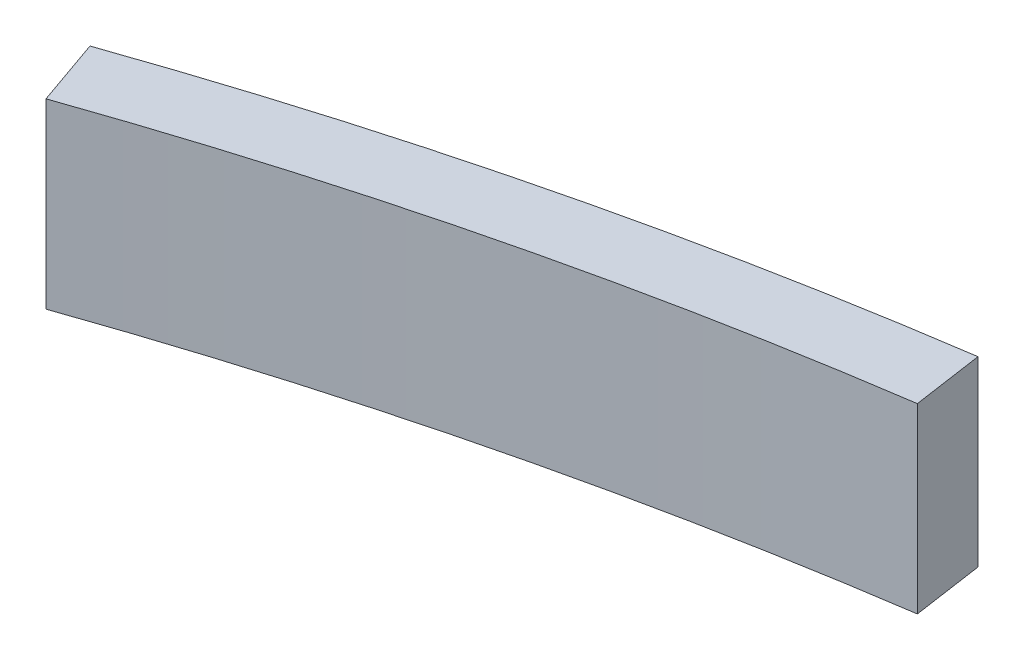
ISO-10303-21;
HEADER;
FILE_DESCRIPTION(('STEP AP214'),'2;1');
FILE_NAME('part.step','',(''),(''),'','','');
FILE_SCHEMA(('AUTOMOTIVE_DESIGN { 1 0 10303 214 1 1 1 1 }'));
ENDSEC;
DATA;
#1=APPLICATION_CONTEXT('core data for automotive mechanical design processes');
#2=APPLICATION_PROTOCOL_DEFINITION('international standard','automotive_design',2000,#1);
#3=PRODUCT_CONTEXT('',#1,'mechanical');
#4=PRODUCT('Part','Part','',(#3));
#5=PRODUCT_RELATED_PRODUCT_CATEGORY('part','',(#4));
#6=PRODUCT_DEFINITION_FORMATION('','',#4);
#7=PRODUCT_DEFINITION_CONTEXT('part definition',#1,'design');
#8=PRODUCT_DEFINITION('design','',#6,#7);
#9=PRODUCT_DEFINITION_SHAPE('','',#8);
#10=(LENGTH_UNIT() NAMED_UNIT(*) SI_UNIT(.MILLI.,.METRE.));
#11=(NAMED_UNIT(*) PLANE_ANGLE_UNIT() SI_UNIT($,.RADIAN.));
#12=(NAMED_UNIT(*) SI_UNIT($,.STERADIAN.) SOLID_ANGLE_UNIT());
#13=UNCERTAINTY_MEASURE_WITH_UNIT(LENGTH_MEASURE(1.E-05),#10,'distance_accuracy_value','');
#14=(GEOMETRIC_REPRESENTATION_CONTEXT(3) GLOBAL_UNCERTAINTY_ASSIGNED_CONTEXT((#13)) GLOBAL_UNIT_ASSIGNED_CONTEXT((#10,
#11,#12)) REPRESENTATION_CONTEXT('',''));
#15=CARTESIAN_POINT('',(0.,0.,0.));
#16=DIRECTION('',(0.,0.,1.));
#17=DIRECTION('',(1.,0.,0.));
#18=AXIS2_PLACEMENT_3D('',#15,#16,#17);
#19=CARTESIAN_POINT('',(0.,25.4,0.));
#20=DIRECTION('',(0.,-1.,0.));
#21=DIRECTION('',(0.,0.,-1.));
#22=AXIS2_PLACEMENT_3D('',#19,#20,#21);
#23=CYLINDRICAL_SURFACE('',#22,524.);
#24=CARTESIAN_POINT('',(0.,0.,0.));
#25=DIRECTION('',(0.,-1.,0.));
#26=DIRECTION('',(0.,0.,-1.));
#27=AXIS2_PLACEMENT_3D('',#24,#25,#26);
#28=CIRCLE('',#27,524.);
#29=CARTESIAN_POINT('',(-173.09106338937,0.,-494.586174265655));
#30=VERTEX_POINT('',#29);
#31=CARTESIAN_POINT('',(-75.5394019961131,0.,-518.526565130534));
#32=VERTEX_POINT('',#31);
#33=EDGE_CURVE('E106',#30,#32,#28,.T.);
#34=ORIENTED_EDGE('',*,*,#33,.T.);
#35=DIRECTION('',(0.,-1.,0.));
#36=VECTOR('',#35,1.);
#37=CARTESIAN_POINT('',(-75.5394019961131,25.4,-518.526565130534));
#38=LINE('',#37,#36);
#39=CARTESIAN_POINT('',(-75.5394019961131,25.4,-518.526565130534));
#40=VERTEX_POINT('',#39);
#41=EDGE_CURVE('E11',#40,#32,#38,.T.);
#42=ORIENTED_EDGE('',*,*,#41,.F.);
#43=CARTESIAN_POINT('',(0.,25.4,0.));
#44=DIRECTION('',(0.,-1.,0.));
#45=DIRECTION('',(0.,0.,-1.));
#46=AXIS2_PLACEMENT_3D('',#43,#44,#45);
#47=CIRCLE('',#46,524.);
#48=CARTESIAN_POINT('',(-173.09106338937,25.4,-494.586174265655));
#49=VERTEX_POINT('',#48);
#50=EDGE_CURVE('E94',#49,#40,#47,.T.);
#51=ORIENTED_EDGE('',*,*,#50,.F.);
#52=DIRECTION('',(0.,-1.,0.));
#53=VECTOR('',#52,1.);
#54=CARTESIAN_POINT('',(-173.09106338937,25.4,-494.586174265655));
#55=LINE('',#54,#53);
#56=EDGE_CURVE('E102',#49,#30,#55,.T.);
#57=ORIENTED_EDGE('',*,*,#56,.T.);
#58=EDGE_LOOP('',(#34,#42,#51,#57));
#59=FACE_BOUND('',#58,.T.);
#60=ADVANCED_FACE('F43',(#59),#23,.F.);
#61=CARTESIAN_POINT('',(-75.5394019961131,25.4,-518.526565130534));
#62=DIRECTION('',(-0.989554513607889,0.,0.14415916411472));
#63=DIRECTION('',(0.14415916411472,0.,0.989554513607889));
#64=AXIS2_PLACEMENT_3D('',#61,#62,#63);
#65=PLANE('',#64);
#66=DIRECTION('',(-0.14415916411472,0.,-0.989554513607889));
#67=VECTOR('',#66,1.);
#68=CARTESIAN_POINT('',(-75.5394019961131,0.,-518.526565130534));
#69=LINE('',#68,#67);
#70=CARTESIAN_POINT('',(-76.9809936372605,0.,-528.422110266613));
#71=VERTEX_POINT('',#70);
#72=EDGE_CURVE('E98',#32,#71,#69,.T.);
#73=ORIENTED_EDGE('',*,*,#72,.T.);
#74=DIRECTION('',(0.,-1.,0.));
#75=VECTOR('',#74,1.);
#76=CARTESIAN_POINT('',(-76.9809936372605,25.4,-528.422110266613));
#77=LINE('',#76,#75);
#78=CARTESIAN_POINT('',(-76.9809936372605,25.4,-528.422110266613));
#79=VERTEX_POINT('',#78);
#80=EDGE_CURVE('E51',#79,#71,#77,.T.);
#81=ORIENTED_EDGE('',*,*,#80,.F.);
#82=DIRECTION('',(-0.14415916411472,0.,-0.989554513607889));
#83=VECTOR('',#82,1.);
#84=CARTESIAN_POINT('',(-75.5394019961131,25.4,-518.526565130534));
#85=LINE('',#84,#83);
#86=EDGE_CURVE('E89',#40,#79,#85,.T.);
#87=ORIENTED_EDGE('',*,*,#86,.F.);
#88=ORIENTED_EDGE('',*,*,#41,.T.);
#89=EDGE_LOOP('',(#73,#81,#87,#88));
#90=FACE_BOUND('',#89,.T.);
#91=ADVANCED_FACE('F97',(#90),#65,.F.);
#92=CARTESIAN_POINT('',(0.,25.4,0.));
#93=DIRECTION('',(0.,-1.,0.));
#94=DIRECTION('',(0.,0.,-1.));
#95=AXIS2_PLACEMENT_3D('',#92,#93,#94);
#96=CYLINDRICAL_SURFACE('',#95,534.);
#97=CARTESIAN_POINT('',(0.,0.,0.));
#98=DIRECTION('',(0.,1.,0.));
#99=DIRECTION('',(0.,0.,-1.));
#100=AXIS2_PLACEMENT_3D('',#97,#98,#99);
#101=CIRCLE('',#100,534.);
#102=CARTESIAN_POINT('',(-176.394327957869,0.,-504.024841713473));
#103=VERTEX_POINT('',#102);
#104=EDGE_CURVE('E76',#71,#103,#101,.T.);
#105=ORIENTED_EDGE('',*,*,#104,.T.);
#106=DIRECTION('',(0.,-1.,0.));
#107=VECTOR('',#106,1.);
#108=CARTESIAN_POINT('',(-176.394327957869,25.4,-504.024841713473));
#109=LINE('',#108,#107);
#110=CARTESIAN_POINT('',(-176.394327957869,25.4,-504.024841713473));
#111=VERTEX_POINT('',#110);
#112=EDGE_CURVE('E99',#111,#103,#109,.T.);
#113=ORIENTED_EDGE('',*,*,#112,.F.);
#114=CARTESIAN_POINT('',(0.,25.4,0.));
#115=DIRECTION('',(0.,1.,0.));
#116=DIRECTION('',(0.,0.,-1.));
#117=AXIS2_PLACEMENT_3D('',#114,#115,#116);
#118=CIRCLE('',#117,534.);
#119=EDGE_CURVE('E92',#79,#111,#118,.T.);
#120=ORIENTED_EDGE('',*,*,#119,.F.);
#121=ORIENTED_EDGE('',*,*,#80,.T.);
#122=EDGE_LOOP('',(#105,#113,#120,#121));
#123=FACE_BOUND('',#122,.T.);
#124=ADVANCED_FACE('F100',(#123),#96,.T.);
#125=CARTESIAN_POINT('',(-173.09106338937,25.4,-494.586174265655));
#126=DIRECTION('',(0.943866744781785,0.,-0.330326456849943));
#127=DIRECTION('',(-0.330326456849943,0.,-0.943866744781785));
#128=AXIS2_PLACEMENT_3D('',#125,#126,#127);
#129=PLANE('',#128);
#130=DIRECTION('',(0.330326456849943,0.,0.943866744781785));
#131=VECTOR('',#130,1.);
#132=CARTESIAN_POINT('',(-173.09106338937,0.,-494.586174265655));
#133=LINE('',#132,#131);
#134=EDGE_CURVE('E82',#103,#30,#133,.T.);
#135=ORIENTED_EDGE('',*,*,#134,.T.);
#136=ORIENTED_EDGE('',*,*,#56,.F.);
#137=DIRECTION('',(0.330326456849943,0.,0.943866744781785));
#138=VECTOR('',#137,1.);
#139=CARTESIAN_POINT('',(-173.09106338937,25.4,-494.586174265655));
#140=LINE('',#139,#138);
#141=EDGE_CURVE('E59',#111,#49,#140,.T.);
#142=ORIENTED_EDGE('',*,*,#141,.F.);
#143=ORIENTED_EDGE('',*,*,#112,.T.);
#144=EDGE_LOOP('',(#135,#136,#142,#143));
#145=FACE_BOUND('',#144,.T.);
#146=ADVANCED_FACE('F113',(#145),#129,.F.);
#147=CARTESIAN_POINT('',(0.,25.4,0.));
#148=DIRECTION('',(0.,-1.,0.));
#149=DIRECTION('',(0.,0.,-1.));
#150=AXIS2_PLACEMENT_3D('',#147,#148,#149);
#151=PLANE('',#150);
#152=ORIENTED_EDGE('',*,*,#50,.T.);
#153=ORIENTED_EDGE('',*,*,#86,.T.);
#154=ORIENTED_EDGE('',*,*,#119,.T.);
#155=ORIENTED_EDGE('',*,*,#141,.T.);
#156=EDGE_LOOP('',(#152,#153,#154,#155));
#157=FACE_BOUND('',#156,.T.);
#158=ADVANCED_FACE('F90',(#157),#151,.F.);
#159=CARTESIAN_POINT('',(0.,0.,0.));
#160=DIRECTION('',(0.,-1.,0.));
#161=DIRECTION('',(0.,0.,-1.));
#162=AXIS2_PLACEMENT_3D('',#159,#160,#161);
#163=PLANE('',#162);
#164=ORIENTED_EDGE('',*,*,#33,.F.);
#165=ORIENTED_EDGE('',*,*,#134,.F.);
#166=ORIENTED_EDGE('',*,*,#104,.F.);
#167=ORIENTED_EDGE('',*,*,#72,.F.);
#168=EDGE_LOOP('',(#164,#165,#166,#167));
#169=FACE_BOUND('',#168,.T.);
#170=ADVANCED_FACE('F116',(#169),#163,.T.);
#171=CLOSED_SHELL('',(#60,#91,#124,#146,#158,#170));
#172=MANIFOLD_SOLID_BREP('B2',#171);
#173=ADVANCED_BREP_SHAPE_REPRESENTATION('',(#18,#172),#14);
#174=SHAPE_DEFINITION_REPRESENTATION(#9,#173);
ENDSEC;
END-ISO-10303-21;
